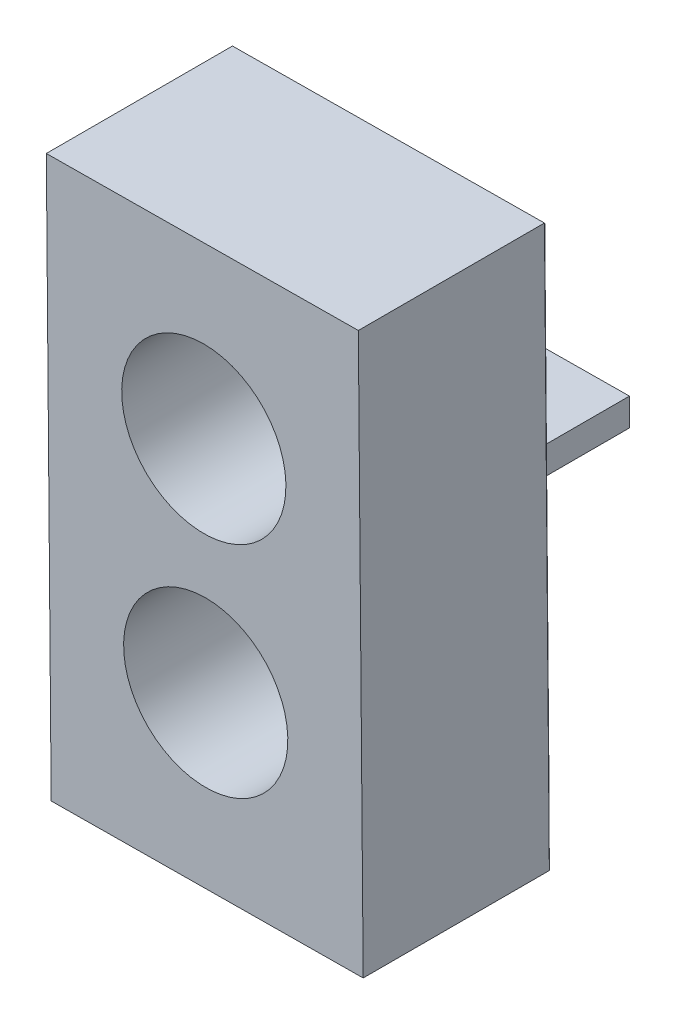
ISO-10303-21;
HEADER;
FILE_DESCRIPTION(('STEP AP214'),'2;1');
FILE_NAME('part.step','',(''),(''),'','','');
FILE_SCHEMA(('AUTOMOTIVE_DESIGN { 1 0 10303 214 1 1 1 1 }'));
ENDSEC;
DATA;
#1=APPLICATION_CONTEXT('core data for automotive mechanical design processes');
#2=APPLICATION_PROTOCOL_DEFINITION('international standard','automotive_design',2000,#1);
#3=PRODUCT_CONTEXT('',#1,'mechanical');
#4=PRODUCT('Part','Part','',(#3));
#5=PRODUCT_RELATED_PRODUCT_CATEGORY('part','',(#4));
#6=PRODUCT_DEFINITION_FORMATION('','',#4);
#7=PRODUCT_DEFINITION_CONTEXT('part definition',#1,'design');
#8=PRODUCT_DEFINITION('design','',#6,#7);
#9=PRODUCT_DEFINITION_SHAPE('','',#8);
#10=(LENGTH_UNIT() NAMED_UNIT(*) SI_UNIT(.MILLI.,.METRE.));
#11=(NAMED_UNIT(*) PLANE_ANGLE_UNIT() SI_UNIT($,.RADIAN.));
#12=(NAMED_UNIT(*) SI_UNIT($,.STERADIAN.) SOLID_ANGLE_UNIT());
#13=UNCERTAINTY_MEASURE_WITH_UNIT(LENGTH_MEASURE(1.E-05),#10,'distance_accuracy_value','');
#14=(GEOMETRIC_REPRESENTATION_CONTEXT(3) GLOBAL_UNCERTAINTY_ASSIGNED_CONTEXT((#13)) GLOBAL_UNIT_ASSIGNED_CONTEXT((#10,
#11,#12)) REPRESENTATION_CONTEXT('',''));
#15=CARTESIAN_POINT('',(0.,0.,0.));
#16=DIRECTION('',(0.,0.,1.));
#17=DIRECTION('',(1.,0.,0.));
#18=AXIS2_PLACEMENT_3D('',#15,#16,#17);
#19=CARTESIAN_POINT('',(2.34965022043466,7.08016306268191,-4.52997500000009));
#20=DIRECTION('',(-0.999961923064171,-0.00872653549837334,0.));
#21=DIRECTION('',(0.00872653549837334,-0.999961923064171,0.));
#22=AXIS2_PLACEMENT_3D('',#19,#20,#21);
#23=PLANE('',#22);
#24=DIRECTION('',(0.,0.,1.));
#25=VECTOR('',#24,1.);
#26=CARTESIAN_POINT('',(2.34746858656006,7.33015354344795,-4.52997500000008));
#27=LINE('',#26,#25);
#28=CARTESIAN_POINT('',(2.34746858656006,7.33015354344796,-6.82997500000008));
#29=VERTEX_POINT('',#28);
#30=CARTESIAN_POINT('',(2.34746858656006,7.33015354344795,-4.52997500000009));
#31=VERTEX_POINT('',#30);
#32=EDGE_CURVE('E112',#29,#31,#27,.T.);
#33=ORIENTED_EDGE('',*,*,#32,.F.);
#34=DIRECTION('',(-0.00872653549838241,0.999961923064171,0.));
#35=VECTOR('',#34,1.);
#36=CARTESIAN_POINT('',(2.35183185430925,6.83017258191588,-6.82997500000008));
#37=LINE('',#36,#35);
#38=CARTESIAN_POINT('',(2.35183185430925,6.83017258191588,-6.82997500000008));
#39=VERTEX_POINT('',#38);
#40=EDGE_CURVE('E110',#39,#29,#37,.T.);
#41=ORIENTED_EDGE('',*,*,#40,.F.);
#42=DIRECTION('',(0.,0.,1.));
#43=VECTOR('',#42,1.);
#44=CARTESIAN_POINT('',(2.35183185430925,6.83017258191586,-4.52997500000009));
#45=LINE('',#44,#43);
#46=CARTESIAN_POINT('',(2.35183185430925,6.83017258191587,-4.52997500000009));
#47=VERTEX_POINT('',#46);
#48=EDGE_CURVE('E99',#47,#39,#45,.F.);
#49=ORIENTED_EDGE('',*,*,#48,.F.);
#50=DIRECTION('',(0.00872653549837334,-0.999961923064171,0.));
#51=VECTOR('',#50,1.);
#52=CARTESIAN_POINT('',(2.34965022043466,7.08016306268191,-4.52997500000009));
#53=LINE('',#52,#51);
#54=EDGE_CURVE('E124',#47,#31,#53,.F.);
#55=ORIENTED_EDGE('',*,*,#54,.T.);
#56=EDGE_LOOP('',(#33,#41,#49,#55));
#57=FACE_BOUND('',#56,.T.);
#58=ADVANCED_FACE('F17',(#57),#23,.T.);
#59=CARTESIAN_POINT('',(5.27953865501268,7.10573181169214,-4.52997500000009));
#60=DIRECTION('',(0.999961923064171,0.00872653549837334,0.));
#61=DIRECTION('',(-0.00872653549837334,0.999961923064171,0.));
#62=AXIS2_PLACEMENT_3D('',#59,#60,#61);
#63=PLANE('',#62);
#64=DIRECTION('',(-0.00872653549837334,0.999961923064171,0.));
#65=VECTOR('',#64,1.);
#66=CARTESIAN_POINT('',(5.27953865501268,7.10573181169214,-4.52997500000008));
#67=LINE('',#66,#65);
#68=CARTESIAN_POINT('',(5.27735702113808,7.35572229245819,-4.52997500000008));
#69=VERTEX_POINT('',#68);
#70=CARTESIAN_POINT('',(5.28172028888727,6.8557413309261,-4.52997500000008));
#71=VERTEX_POINT('',#70);
#72=EDGE_CURVE('E114',#69,#71,#67,.F.);
#73=ORIENTED_EDGE('',*,*,#72,.T.);
#74=DIRECTION('',(0.,0.,1.));
#75=VECTOR('',#74,1.);
#76=CARTESIAN_POINT('',(5.28172028888727,6.8557413309261,-4.52997500000009));
#77=LINE('',#76,#75);
#78=CARTESIAN_POINT('',(5.28172028888727,6.85574133092611,-6.82997500000009));
#79=VERTEX_POINT('',#78);
#80=EDGE_CURVE('E117',#79,#71,#77,.T.);
#81=ORIENTED_EDGE('',*,*,#80,.F.);
#82=DIRECTION('',(0.00872653549838067,-0.999961923064171,0.));
#83=VECTOR('',#82,1.);
#84=CARTESIAN_POINT('',(5.27735702113808,7.35572229245819,-6.82997500000008));
#85=LINE('',#84,#83);
#86=CARTESIAN_POINT('',(5.27735702113808,7.35572229245819,-6.82997500000009));
#87=VERTEX_POINT('',#86);
#88=EDGE_CURVE('E93',#87,#79,#85,.T.);
#89=ORIENTED_EDGE('',*,*,#88,.F.);
#90=DIRECTION('',(0.,0.,1.));
#91=VECTOR('',#90,1.);
#92=CARTESIAN_POINT('',(5.27735702113808,7.35572229245819,-4.52997500000008));
#93=LINE('',#92,#91);
#94=EDGE_CURVE('E180',#69,#87,#93,.F.);
#95=ORIENTED_EDGE('',*,*,#94,.F.);
#96=EDGE_LOOP('',(#73,#81,#89,#95));
#97=FACE_BOUND('',#96,.T.);
#98=ADVANCED_FACE('F188',(#97),#63,.T.);
#99=CARTESIAN_POINT('',(10.9614681152993,8.05535152943565,-6.82997500000008));
#100=DIRECTION('',(0.,0.,-1.));
#101=DIRECTION('',(0.,1.,0.));
#102=AXIS2_PLACEMENT_3D('',#99,#100,#101);
#103=PLANE('',#102);
#104=ORIENTED_EDGE('',*,*,#88,.T.);
#105=DIRECTION('',(0.999961923064171,0.00872653549837334,0.));
#106=VECTOR('',#105,1.);
#107=CARTESIAN_POINT('',(3.81677607159826,6.84295695642099,-6.82997500000009));
#108=LINE('',#107,#106);
#109=EDGE_CURVE('E103',#39,#79,#108,.T.);
#110=ORIENTED_EDGE('',*,*,#109,.F.);
#111=ORIENTED_EDGE('',*,*,#40,.T.);
#112=DIRECTION('',(-0.999961923064171,-0.00872653549837334,0.));
#113=VECTOR('',#112,1.);
#114=CARTESIAN_POINT('',(3.81241280384907,7.34293791795308,-6.82997500000008));
#115=LINE('',#114,#113);
#116=EDGE_CURVE('E178',#87,#29,#115,.T.);
#117=ORIENTED_EDGE('',*,*,#116,.F.);
#118=EDGE_LOOP('',(#104,#110,#111,#117));
#119=FACE_BOUND('',#118,.T.);
#120=ADVANCED_FACE('F116',(#119),#103,.T.);
#121=CARTESIAN_POINT('',(3.81677607159826,6.84295695642098,-4.52997500000009));
#122=DIRECTION('',(0.00872653549837334,-0.999961923064171,0.));
#123=DIRECTION('',(0.999961923064171,0.00872653549837334,0.));
#124=AXIS2_PLACEMENT_3D('',#121,#122,#123);
#125=PLANE('',#124);
#126=ORIENTED_EDGE('',*,*,#80,.T.);
#127=DIRECTION('',(0.999961923064171,0.00872653549837196,0.));
#128=VECTOR('',#127,1.);
#129=CARTESIAN_POINT('',(2.35183185430925,6.83017258191587,-4.52997500000008));
#130=LINE('',#129,#128);
#131=EDGE_CURVE('E106',#47,#71,#130,.T.);
#132=ORIENTED_EDGE('',*,*,#131,.F.);
#133=ORIENTED_EDGE('',*,*,#48,.T.);
#134=ORIENTED_EDGE('',*,*,#109,.T.);
#135=EDGE_LOOP('',(#126,#132,#133,#134));
#136=FACE_BOUND('',#135,.T.);
#137=ADVANCED_FACE('F102',(#136),#125,.T.);
#138=CARTESIAN_POINT('',(3.81241280384907,7.34293791795307,-4.52997500000008));
#139=DIRECTION('',(-0.00872653549837334,0.999961923064171,0.));
#140=DIRECTION('',(-0.999961923064171,-0.00872653549837334,0.));
#141=AXIS2_PLACEMENT_3D('',#138,#139,#140);
#142=PLANE('',#141);
#143=ORIENTED_EDGE('',*,*,#94,.T.);
#144=ORIENTED_EDGE('',*,*,#116,.T.);
#145=ORIENTED_EDGE('',*,*,#32,.T.);
#146=DIRECTION('',(-0.999961923064171,-0.00872653549837551,0.));
#147=VECTOR('',#146,1.);
#148=CARTESIAN_POINT('',(5.27735702113808,7.35572229245819,-4.52997500000008));
#149=LINE('',#148,#147);
#150=EDGE_CURVE('E166',#69,#31,#149,.T.);
#151=ORIENTED_EDGE('',*,*,#150,.F.);
#152=EDGE_LOOP('',(#143,#144,#145,#151));
#153=FACE_BOUND('',#152,.T.);
#154=ADVANCED_FACE('F183',(#153),#142,.T.);
#155=CARTESIAN_POINT('',(7.43634549268559,2.32437120356318,-4.2299750000001));
#156=DIRECTION('',(0.00617059242716491,-0.707079856727014,-0.70710678118655));
#157=DIRECTION('',(0.,0.707120243544463,-0.707093318572322));
#158=AXIS2_PLACEMENT_3D('',#155,#156,#157);
#159=PLANE('',#158);
#160=DIRECTION('',(-0.999961923064171,-0.00872653549837326,0.));
#161=VECTOR('',#160,1.);
#162=CARTESIAN_POINT('',(6.10877798397605,2.61279712094709,-4.5299750000001));
#163=LINE('',#162,#161);
#164=CARTESIAN_POINT('',(6.10877798397605,2.61279712094709,-4.5299750000001));
#165=VERTEX_POINT('',#164);
#166=CARTESIAN_POINT('',(1.60894933018728,2.57352771120441,-4.5299750000001));
#167=VERTEX_POINT('',#166);
#168=EDGE_CURVE('E156',#165,#167,#163,.T.);
#169=ORIENTED_EDGE('',*,*,#168,.F.);
#170=DIRECTION('',(-0.582366553079556,0.572290017841396,-0.577350269189624));
#171=VECTOR('',#170,1.);
#172=CARTESIAN_POINT('',(6.71399105911358,2.01805588840761,-3.9299750000001));
#173=LINE('',#172,#171);
#174=CARTESIAN_POINT('',(6.71399105911358,2.01805588840761,-3.9299750000001));
#175=VERTEX_POINT('',#174);
#176=EDGE_CURVE('E172',#175,#165,#173,.T.);
#177=ORIENTED_EDGE('',*,*,#176,.F.);
#178=DIRECTION('',(0.999961923064171,0.00872653549837334,0.));
#179=VECTOR('',#178,1.);
#180=CARTESIAN_POINT('',(3.86409957838069,1.99318526223724,-3.9299750000001));
#181=LINE('',#180,#179);
#182=CARTESIAN_POINT('',(1.0142080976478,1.96831463606688,-3.9299750000001));
#183=VERTEX_POINT('',#182);
#184=EDGE_CURVE('E154',#183,#175,#181,.T.);
#185=ORIENTED_EDGE('',*,*,#184,.F.);
#186=DIRECTION('',(-0.572290017841397,-0.582366553079556,0.577350269189623));
#187=VECTOR('',#186,1.);
#188=CARTESIAN_POINT('',(1.60894933018728,2.57352771120441,-4.5299750000001));
#189=LINE('',#188,#187);
#190=EDGE_CURVE('E176',#167,#183,#189,.T.);
#191=ORIENTED_EDGE('',*,*,#190,.F.);
#192=EDGE_LOOP('',(#169,#177,#185,#191));
#193=FACE_BOUND('',#192,.T.);
#194=ADVANCED_FACE('F242',(#193),#159,.T.);
#195=CARTESIAN_POINT('',(1.26576440255108,7.52072126972254,-4.22997500000008));
#196=DIRECTION('',(-0.707079856727016,-0.00617059242716232,-0.707106781186548));
#197=DIRECTION('',(-0.707120243544461,0.,0.707093318572324));
#198=AXIS2_PLACEMENT_3D('',#195,#196,#197);
#199=PLANE('',#198);
#200=DIRECTION('',(-0.0087265354983735,0.999961923064171,0.));
#201=VECTOR('',#200,1.);
#202=CARTESIAN_POINT('',(1.60894933018728,2.57352771120441,-4.5299750000001));
#203=LINE('',#202,#201);
#204=CARTESIAN_POINT('',(1.53041051070192,11.5731850187819,-4.52997500000007));
#205=VERTEX_POINT('',#204);
#206=EDGE_CURVE('E164',#167,#205,#203,.T.);
#207=ORIENTED_EDGE('',*,*,#206,.F.);
#208=ORIENTED_EDGE('',*,*,#190,.T.);
#209=DIRECTION('',(0.00872653549837334,-0.999961923064171,0.));
#210=VECTOR('',#209,1.);
#211=CARTESIAN_POINT('',(0.9697027666061,7.06812044369414,-3.92997500000007));
#212=LINE('',#211,#210);
#213=CARTESIAN_POINT('',(0.925197435564395,12.1679262513214,-3.92997500000007));
#214=VERTEX_POINT('',#213);
#215=EDGE_CURVE('E151',#214,#183,#212,.T.);
#216=ORIENTED_EDGE('',*,*,#215,.F.);
#217=DIRECTION('',(-0.582366553079548,0.572290017841398,0.577350269189631));
#218=VECTOR('',#217,1.);
#219=CARTESIAN_POINT('',(1.53041051070192,11.5731850187819,-4.52997500000008));
#220=LINE('',#219,#218);
#221=EDGE_CURVE('E174',#205,#214,#220,.T.);
#222=ORIENTED_EDGE('',*,*,#221,.F.);
#223=EDGE_LOOP('',(#207,#208,#216,#222));
#224=FACE_BOUND('',#223,.T.);
#225=ADVANCED_FACE('F238',(#224),#199,.T.);
#226=CARTESIAN_POINT('',(7.35257075190121,11.9240056649792,-4.22997500000007));
#227=DIRECTION('',(-0.00617059242716493,0.707079856727019,-0.707106781186545));
#228=DIRECTION('',(0.,0.707120243544458,0.707093318572327));
#229=AXIS2_PLACEMENT_3D('',#226,#227,#228);
#230=PLANE('',#229);
#231=DIRECTION('',(0.999961923064171,0.00872653549837807,0.));
#232=VECTOR('',#231,1.);
#233=CARTESIAN_POINT('',(1.53041051070192,11.5731850187819,-4.52997500000007));
#234=LINE('',#233,#232);
#235=CARTESIAN_POINT('',(6.03023916449069,11.6124544285246,-4.52997500000007));
#236=VERTEX_POINT('',#235);
#237=EDGE_CURVE('E162',#205,#236,#234,.T.);
#238=ORIENTED_EDGE('',*,*,#237,.F.);
#239=ORIENTED_EDGE('',*,*,#221,.T.);
#240=DIRECTION('',(-0.999961923064171,-0.00872653549837334,0.));
#241=VECTOR('',#240,1.);
#242=CARTESIAN_POINT('',(3.77508891629728,12.1927968774918,-3.92997500000007));
#243=LINE('',#242,#241);
#244=CARTESIAN_POINT('',(6.62498039703017,12.2176675036622,-3.92997500000006));
#245=VERTEX_POINT('',#244);
#246=EDGE_CURVE('E146',#245,#214,#243,.T.);
#247=ORIENTED_EDGE('',*,*,#246,.F.);
#248=DIRECTION('',(0.572290017841372,0.5823665530796,0.577350269189603));
#249=VECTOR('',#248,1.);
#250=CARTESIAN_POINT('',(6.03023916449069,11.6124544285246,-4.52997500000007));
#251=LINE('',#250,#249);
#252=EDGE_CURVE('E170',#236,#245,#251,.T.);
#253=ORIENTED_EDGE('',*,*,#252,.F.);
#254=EDGE_LOOP('',(#238,#239,#247,#253));
#255=FACE_BOUND('',#254,.T.);
#256=ADVANCED_FACE('F234',(#255),#230,.T.);
#257=CARTESIAN_POINT('',(6.36557021017836,7.56522660076425,-4.22997500000008));
#258=DIRECTION('',(0.707079856727015,0.00617059242716751,-0.707106781186548));
#259=DIRECTION('',(-0.707120243544462,0.,-0.707093318572323));
#260=AXIS2_PLACEMENT_3D('',#257,#258,#259);
#261=PLANE('',#260);
#262=DIRECTION('',(0.00872653549837338,-0.999961923064171,0.));
#263=VECTOR('',#262,1.);
#264=CARTESIAN_POINT('',(6.03023916449069,11.6124544285246,-4.52997500000007));
#265=LINE('',#264,#263);
#266=EDGE_CURVE('E159',#236,#165,#265,.T.);
#267=ORIENTED_EDGE('',*,*,#266,.F.);
#268=ORIENTED_EDGE('',*,*,#252,.T.);
#269=DIRECTION('',(-0.00872653549837334,0.999961923064171,0.));
#270=VECTOR('',#269,1.);
#271=CARTESIAN_POINT('',(6.66948572807188,7.11786169603487,-3.9299750000001));
#272=LINE('',#271,#270);
#273=EDGE_CURVE('E138',#175,#245,#272,.T.);
#274=ORIENTED_EDGE('',*,*,#273,.F.);
#275=ORIENTED_EDGE('',*,*,#176,.T.);
#276=EDGE_LOOP('',(#267,#268,#274,#275));
#277=FACE_BOUND('',#276,.T.);
#278=ADVANCED_FACE('F230',(#277),#261,.T.);
#279=CARTESIAN_POINT('',(10.9614681152993,8.05535152943564,-4.52997500000008));
#280=DIRECTION('',(0.,0.,-1.));
#281=DIRECTION('',(0.,1.,0.));
#282=AXIS2_PLACEMENT_3D('',#279,#280,#281);
#283=PLANE('',#282);
#284=ORIENTED_EDGE('',*,*,#266,.T.);
#285=ORIENTED_EDGE('',*,*,#168,.T.);
#286=ORIENTED_EDGE('',*,*,#206,.T.);
#287=ORIENTED_EDGE('',*,*,#237,.T.);
#288=EDGE_LOOP('',(#284,#285,#286,#287));
#289=FACE_BOUND('',#288,.T.);
#290=ORIENTED_EDGE('',*,*,#72,.F.);
#291=ORIENTED_EDGE('',*,*,#150,.T.);
#292=ORIENTED_EDGE('',*,*,#54,.F.);
#293=ORIENTED_EDGE('',*,*,#131,.T.);
#294=EDGE_LOOP('',(#290,#291,#292,#293));
#295=FACE_BOUND('',#294,.T.);
#296=CARTESIAN_POINT('',(3.80214117634224,9.09291491599286,-4.52997500000008));
#297=DIRECTION('',(0.,0.,-1.));
#298=DIRECTION('',(0.,1.,0.));
#299=AXIS2_PLACEMENT_3D('',#296,#297,#298);
#300=CIRCLE('',#299,1.5);
#301=CARTESIAN_POINT('',(3.80214117634224,10.5929149159929,-4.52997500000007));
#302=VERTEX_POINT('',#301);
#303=EDGE_CURVE('E129',#302,#302,#300,.F.);
#304=ORIENTED_EDGE('',*,*,#303,.T.);
#305=EDGE_LOOP('',(#304));
#306=FACE_BOUND('',#305,.T.);
#307=CARTESIAN_POINT('',(3.83704731833573,5.09306722373618,-4.52997500000009));
#308=DIRECTION('',(0.,0.,-1.));
#309=DIRECTION('',(0.,1.,0.));
#310=AXIS2_PLACEMENT_3D('',#307,#308,#309);
#311=CIRCLE('',#310,1.5);
#312=CARTESIAN_POINT('',(3.83704731833573,6.59306722373618,-4.52997500000008));
#313=VERTEX_POINT('',#312);
#314=EDGE_CURVE('E20',#313,#313,#311,.F.);
#315=ORIENTED_EDGE('',*,*,#314,.T.);
#316=EDGE_LOOP('',(#315));
#317=FACE_BOUND('',#316,.T.);
#318=ADVANCED_FACE('F185',(#289,#295,#306,#317),#283,.T.);
#319=CARTESIAN_POINT('',(3.83704731833573,5.09306722373618,-4.52997500000009));
#320=DIRECTION('',(0.,0.,-1.));
#321=DIRECTION('',(0.,1.,0.));
#322=AXIS2_PLACEMENT_3D('',#319,#320,#321);
#323=CYLINDRICAL_SURFACE('',#322,1.5);
#324=ORIENTED_EDGE('',*,*,#314,.F.);
#325=EDGE_LOOP('',(#324));
#326=FACE_BOUND('',#325,.T.);
#327=CARTESIAN_POINT('',(3.83704731833573,5.09306722373617,-0.529975000000092));
#328=DIRECTION('',(0.,0.,-1.));
#329=DIRECTION('',(0.,1.,0.));
#330=AXIS2_PLACEMENT_3D('',#327,#328,#329);
#331=CIRCLE('',#330,1.5);
#332=CARTESIAN_POINT('',(3.83704731833573,6.59306722373617,-0.529975000000087));
#333=VERTEX_POINT('',#332);
#334=EDGE_CURVE('E126',#333,#333,#331,.F.);
#335=ORIENTED_EDGE('',*,*,#334,.T.);
#336=EDGE_LOOP('',(#335));
#337=FACE_BOUND('',#336,.T.);
#338=ADVANCED_FACE('F223',(#326,#337),#323,.F.);
#339=CARTESIAN_POINT('',(3.86409957838069,1.99318526223723,-0.529975000000103));
#340=DIRECTION('',(0.00872653549837334,-0.999961923064171,0.));
#341=DIRECTION('',(0.999961923064171,0.00872653549837334,0.));
#342=AXIS2_PLACEMENT_3D('',#339,#340,#341);
#343=PLANE('',#342);
#344=DIRECTION('',(-0.999961923064171,-0.00872653549837379,0.));
#345=VECTOR('',#344,1.);
#346=CARTESIAN_POINT('',(6.71399105911358,2.0180558884076,-0.529975000000104));
#347=LINE('',#346,#345);
#348=CARTESIAN_POINT('',(6.71399105911358,2.0180558884076,-0.529975000000094));
#349=VERTEX_POINT('',#348);
#350=CARTESIAN_POINT('',(1.0142080976478,1.96831463606687,-0.529975000000103));
#351=VERTEX_POINT('',#350);
#352=EDGE_CURVE('E128',#349,#351,#347,.T.);
#353=ORIENTED_EDGE('',*,*,#352,.T.);
#354=DIRECTION('',(0.,0.,1.));
#355=VECTOR('',#354,1.);
#356=CARTESIAN_POINT('',(1.0142080976478,1.96831463606688,-0.529975000000085));
#357=LINE('',#356,#355);
#358=EDGE_CURVE('E149',#183,#351,#357,.T.);
#359=ORIENTED_EDGE('',*,*,#358,.F.);
#360=ORIENTED_EDGE('',*,*,#184,.T.);
#361=DIRECTION('',(0.,0.,1.));
#362=VECTOR('',#361,1.);
#363=CARTESIAN_POINT('',(6.71399105911358,2.0180558884076,-0.529975000000085));
#364=LINE('',#363,#362);
#365=EDGE_CURVE('E131',#349,#175,#364,.F.);
#366=ORIENTED_EDGE('',*,*,#365,.F.);
#367=EDGE_LOOP('',(#353,#359,#360,#366));
#368=FACE_BOUND('',#367,.T.);
#369=ADVANCED_FACE('F219',(#368),#343,.T.);
#370=CARTESIAN_POINT('',(0.9697027666061,7.06812044369414,-0.529975000000085));
#371=DIRECTION('',(-0.999961923064171,-0.00872653549837334,0.));
#372=DIRECTION('',(0.00872653549837334,-0.999961923064171,0.));
#373=AXIS2_PLACEMENT_3D('',#370,#371,#372);
#374=PLANE('',#373);
#375=DIRECTION('',(-0.00872653549837315,0.999961923064171,0.));
#376=VECTOR('',#375,1.);
#377=CARTESIAN_POINT('',(1.0142080976478,1.96831463606687,-0.529975000000104));
#378=LINE('',#377,#376);
#379=CARTESIAN_POINT('',(0.925197435564395,12.1679262513214,-0.529975000000085));
#380=VERTEX_POINT('',#379);
#381=EDGE_CURVE('E370',#351,#380,#378,.T.);
#382=ORIENTED_EDGE('',*,*,#381,.T.);
#383=DIRECTION('',(0.,0.,1.));
#384=VECTOR('',#383,1.);
#385=CARTESIAN_POINT('',(0.925197435564394,12.1679262513214,-0.529975000000066));
#386=LINE('',#385,#384);
#387=EDGE_CURVE('E144',#214,#380,#386,.T.);
#388=ORIENTED_EDGE('',*,*,#387,.F.);
#389=ORIENTED_EDGE('',*,*,#215,.T.);
#390=ORIENTED_EDGE('',*,*,#358,.T.);
#391=EDGE_LOOP('',(#382,#388,#389,#390));
#392=FACE_BOUND('',#391,.T.);
#393=ADVANCED_FACE('F215',(#392),#374,.T.);
#394=CARTESIAN_POINT('',(3.77508891629728,12.1927968774918,-0.529975000000066));
#395=DIRECTION('',(-0.00872653549837334,0.999961923064171,0.));
#396=DIRECTION('',(-0.999961923064171,-0.00872653549837334,0.));
#397=AXIS2_PLACEMENT_3D('',#394,#395,#396);
#398=PLANE('',#397);
#399=DIRECTION('',(0.999961923064171,0.00872653549836832,0.));
#400=VECTOR('',#399,1.);
#401=CARTESIAN_POINT('',(0.925197435564394,12.1679262513214,-0.529975000000067));
#402=LINE('',#401,#400);
#403=CARTESIAN_POINT('',(6.62498039703017,12.2176675036622,-0.529975000000066));
#404=VERTEX_POINT('',#403);
#405=EDGE_CURVE('E368',#380,#404,#402,.T.);
#406=ORIENTED_EDGE('',*,*,#405,.T.);
#407=DIRECTION('',(0.,0.,1.));
#408=VECTOR('',#407,1.);
#409=CARTESIAN_POINT('',(6.62498039703017,12.2176675036622,-0.529975000000085));
#410=LINE('',#409,#408);
#411=EDGE_CURVE('E35',#245,#404,#410,.T.);
#412=ORIENTED_EDGE('',*,*,#411,.F.);
#413=ORIENTED_EDGE('',*,*,#246,.T.);
#414=ORIENTED_EDGE('',*,*,#387,.T.);
#415=EDGE_LOOP('',(#406,#412,#413,#414));
#416=FACE_BOUND('',#415,.T.);
#417=ADVANCED_FACE('F212',(#416),#398,.T.);
#418=CARTESIAN_POINT('',(6.66948572807188,7.11786169603487,-0.529975000000085));
#419=DIRECTION('',(0.999961923064171,0.00872653549837334,0.));
#420=DIRECTION('',(-0.00872653549837334,0.999961923064171,0.));
#421=AXIS2_PLACEMENT_3D('',#418,#419,#420);
#422=PLANE('',#421);
#423=DIRECTION('',(0.0087265354983736,-0.999961923064171,0.));
#424=VECTOR('',#423,1.);
#425=CARTESIAN_POINT('',(6.62498039703017,12.2176675036621,-0.529975000000067));
#426=LINE('',#425,#424);
#427=EDGE_CURVE('E26',#404,#349,#426,.T.);
#428=ORIENTED_EDGE('',*,*,#427,.T.);
#429=ORIENTED_EDGE('',*,*,#365,.T.);
#430=ORIENTED_EDGE('',*,*,#273,.T.);
#431=ORIENTED_EDGE('',*,*,#411,.T.);
#432=EDGE_LOOP('',(#428,#429,#430,#431));
#433=FACE_BOUND('',#432,.T.);
#434=ADVANCED_FACE('F204',(#433),#422,.T.);
#435=CARTESIAN_POINT('',(3.80214117634224,9.09291491599286,-4.52997500000008));
#436=DIRECTION('',(0.,0.,-1.));
#437=DIRECTION('',(0.,1.,0.));
#438=AXIS2_PLACEMENT_3D('',#435,#436,#437);
#439=CYLINDRICAL_SURFACE('',#438,1.5);
#440=ORIENTED_EDGE('',*,*,#303,.F.);
#441=EDGE_LOOP('',(#440));
#442=FACE_BOUND('',#441,.T.);
#443=CARTESIAN_POINT('',(3.80214117634224,9.09291491599285,-0.529975000000077));
#444=DIRECTION('',(0.,0.,-1.));
#445=DIRECTION('',(0.,1.,0.));
#446=AXIS2_PLACEMENT_3D('',#443,#444,#445);
#447=CIRCLE('',#446,1.5);
#448=CARTESIAN_POINT('',(3.80214117634224,10.5929149159928,-0.529975000000071));
#449=VERTEX_POINT('',#448);
#450=EDGE_CURVE('E11',#449,#449,#447,.F.);
#451=ORIENTED_EDGE('',*,*,#450,.T.);
#452=EDGE_LOOP('',(#451));
#453=FACE_BOUND('',#452,.T.);
#454=ADVANCED_FACE('F198',(#442,#453),#439,.F.);
#455=CARTESIAN_POINT('',(10.9614681152993,8.05535152943563,-0.529975000000082));
#456=DIRECTION('',(0.,0.,-1.));
#457=DIRECTION('',(0.,1.,0.));
#458=AXIS2_PLACEMENT_3D('',#455,#456,#457);
#459=PLANE('',#458);
#460=ORIENTED_EDGE('',*,*,#450,.F.);
#461=EDGE_LOOP('',(#460));
#462=FACE_BOUND('',#461,.T.);
#463=ORIENTED_EDGE('',*,*,#405,.F.);
#464=ORIENTED_EDGE('',*,*,#381,.F.);
#465=ORIENTED_EDGE('',*,*,#352,.F.);
#466=ORIENTED_EDGE('',*,*,#427,.F.);
#467=EDGE_LOOP('',(#463,#464,#465,#466));
#468=FACE_BOUND('',#467,.T.);
#469=ORIENTED_EDGE('',*,*,#334,.F.);
#470=EDGE_LOOP('',(#469));
#471=FACE_BOUND('',#470,.T.);
#472=ADVANCED_FACE('F196',(#462,#468,#471),#459,.F.);
#473=CLOSED_SHELL('',(#58,#98,#120,#137,#154,#194,#225,#256,#278,#318,#338,#369,#393,#417,#434,
#454,#472));
#474=MANIFOLD_SOLID_BREP('B1',#473);
#475=ADVANCED_BREP_SHAPE_REPRESENTATION('',(#18,#474),#14);
#476=SHAPE_DEFINITION_REPRESENTATION(#9,#475);
ENDSEC;
END-ISO-10303-21;
